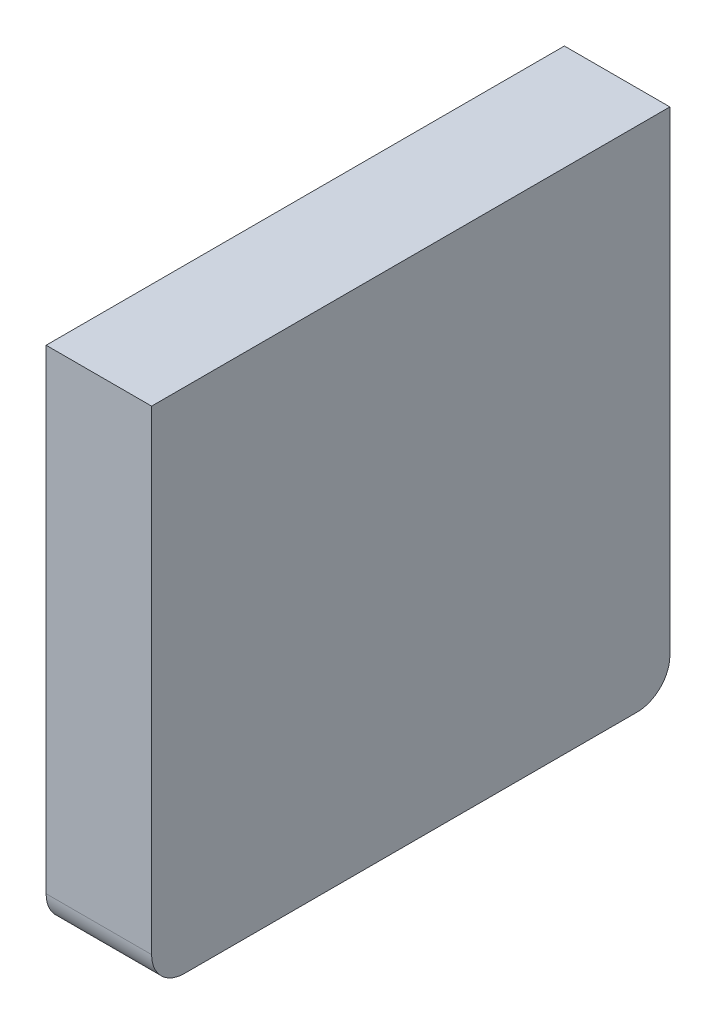
ISO-10303-21;
HEADER;
FILE_DESCRIPTION(('STEP AP214'),'2;1');
FILE_NAME('part.step','',(''),(''),'','','');
FILE_SCHEMA(('AUTOMOTIVE_DESIGN { 1 0 10303 214 1 1 1 1 }'));
ENDSEC;
DATA;
#1=APPLICATION_CONTEXT('core data for automotive mechanical design processes');
#2=APPLICATION_PROTOCOL_DEFINITION('international standard','automotive_design',2000,#1);
#3=PRODUCT_CONTEXT('',#1,'mechanical');
#4=PRODUCT('Part','Part','',(#3));
#5=PRODUCT_RELATED_PRODUCT_CATEGORY('part','',(#4));
#6=PRODUCT_DEFINITION_FORMATION('','',#4);
#7=PRODUCT_DEFINITION_CONTEXT('part definition',#1,'design');
#8=PRODUCT_DEFINITION('design','',#6,#7);
#9=PRODUCT_DEFINITION_SHAPE('','',#8);
#10=(LENGTH_UNIT() NAMED_UNIT(*) SI_UNIT(.MILLI.,.METRE.));
#11=(NAMED_UNIT(*) PLANE_ANGLE_UNIT() SI_UNIT($,.RADIAN.));
#12=(NAMED_UNIT(*) SI_UNIT($,.STERADIAN.) SOLID_ANGLE_UNIT());
#13=UNCERTAINTY_MEASURE_WITH_UNIT(LENGTH_MEASURE(1.E-05),#10,'distance_accuracy_value','');
#14=(GEOMETRIC_REPRESENTATION_CONTEXT(3) GLOBAL_UNCERTAINTY_ASSIGNED_CONTEXT((#13)) GLOBAL_UNIT_ASSIGNED_CONTEXT((#10,
#11,#12)) REPRESENTATION_CONTEXT('',''));
#15=CARTESIAN_POINT('',(0.,0.,0.));
#16=DIRECTION('',(0.,0.,1.));
#17=DIRECTION('',(1.,0.,0.));
#18=AXIS2_PLACEMENT_3D('',#15,#16,#17);
#19=CARTESIAN_POINT('',(0.,0.,803.656));
#20=DIRECTION('',(1.,0.,0.));
#21=DIRECTION('',(0.,0.,-1.));
#22=AXIS2_PLACEMENT_3D('',#19,#20,#21);
#23=PLANE('',#22);
#24=DIRECTION('',(0.,-1.,0.));
#25=VECTOR('',#24,1.);
#26=CARTESIAN_POINT('',(0.,0.,0.));
#27=LINE('',#26,#25);
#28=CARTESIAN_POINT('',(0.,787.4,0.));
#29=VERTEX_POINT('',#28);
#30=CARTESIAN_POINT('',(0.,50.8,0.));
#31=VERTEX_POINT('',#30);
#32=EDGE_CURVE('E115',#29,#31,#27,.T.);
#33=ORIENTED_EDGE('',*,*,#32,.T.);
#34=CARTESIAN_POINT('',(0.,50.8,50.8));
#35=DIRECTION('',(1.,0.,0.));
#36=DIRECTION('',(0.,0.,-1.));
#37=AXIS2_PLACEMENT_3D('',#34,#35,#36);
#38=CIRCLE('',#37,50.8);
#39=CARTESIAN_POINT('',(0.,0.,50.8));
#40=VERTEX_POINT('',#39);
#41=EDGE_CURVE('E41',#31,#40,#38,.F.);
#42=ORIENTED_EDGE('',*,*,#41,.T.);
#43=DIRECTION('',(0.,0.,-1.));
#44=VECTOR('',#43,1.);
#45=CARTESIAN_POINT('',(0.,0.,803.656));
#46=LINE('',#45,#44);
#47=CARTESIAN_POINT('',(0.,0.,752.856));
#48=VERTEX_POINT('',#47);
#49=EDGE_CURVE('E121',#48,#40,#46,.T.);
#50=ORIENTED_EDGE('',*,*,#49,.F.);
#51=CARTESIAN_POINT('',(0.,50.8,752.856));
#52=DIRECTION('',(1.,0.,0.));
#53=DIRECTION('',(0.,0.,-1.));
#54=AXIS2_PLACEMENT_3D('',#51,#52,#53);
#55=CIRCLE('',#54,50.8);
#56=CARTESIAN_POINT('',(0.,50.8,803.656));
#57=VERTEX_POINT('',#56);
#58=EDGE_CURVE('E48',#48,#57,#55,.F.);
#59=ORIENTED_EDGE('',*,*,#58,.T.);
#60=DIRECTION('',(0.,-1.,0.));
#61=VECTOR('',#60,1.);
#62=CARTESIAN_POINT('',(0.,0.,803.656));
#63=LINE('',#62,#61);
#64=CARTESIAN_POINT('',(0.,787.4,803.656));
#65=VERTEX_POINT('',#64);
#66=EDGE_CURVE('E97',#65,#57,#63,.T.);
#67=ORIENTED_EDGE('',*,*,#66,.F.);
#68=DIRECTION('',(0.,0.,-1.));
#69=VECTOR('',#68,1.);
#70=CARTESIAN_POINT('',(0.,787.4,803.656));
#71=LINE('',#70,#69);
#72=EDGE_CURVE('E107',#65,#29,#71,.T.);
#73=ORIENTED_EDGE('',*,*,#72,.T.);
#74=EDGE_LOOP('',(#33,#42,#50,#59,#67,#73));
#75=FACE_BOUND('',#74,.T.);
#76=ADVANCED_FACE('F33',(#75),#23,.F.);
#77=CARTESIAN_POINT('',(0.,0.,803.656));
#78=DIRECTION('',(0.,1.,0.));
#79=DIRECTION('',(0.,0.,1.));
#80=AXIS2_PLACEMENT_3D('',#77,#78,#79);
#81=PLANE('',#80);
#82=ORIENTED_EDGE('',*,*,#49,.T.);
#83=DIRECTION('',(1.,0.,0.));
#84=VECTOR('',#83,1.);
#85=CARTESIAN_POINT('',(163.576,0.,50.8));
#86=LINE('',#85,#84);
#87=CARTESIAN_POINT('',(163.576,0.,50.8));
#88=VERTEX_POINT('',#87);
#89=EDGE_CURVE('E126',#40,#88,#86,.T.);
#90=ORIENTED_EDGE('',*,*,#89,.T.);
#91=DIRECTION('',(0.,0.,-1.));
#92=VECTOR('',#91,1.);
#93=CARTESIAN_POINT('',(163.576,0.,803.656));
#94=LINE('',#93,#92);
#95=CARTESIAN_POINT('',(163.576,0.,752.856));
#96=VERTEX_POINT('',#95);
#97=EDGE_CURVE('E106',#96,#88,#94,.T.);
#98=ORIENTED_EDGE('',*,*,#97,.F.);
#99=DIRECTION('',(1.,0.,0.));
#100=VECTOR('',#99,1.);
#101=CARTESIAN_POINT('',(0.,0.,752.856));
#102=LINE('',#101,#100);
#103=EDGE_CURVE('E124',#96,#48,#102,.F.);
#104=ORIENTED_EDGE('',*,*,#103,.T.);
#105=EDGE_LOOP('',(#82,#90,#98,#104));
#106=FACE_BOUND('',#105,.T.);
#107=ADVANCED_FACE('F138',(#106),#81,.F.);
#108=CARTESIAN_POINT('',(163.576,0.,803.656));
#109=DIRECTION('',(-1.,0.,0.));
#110=DIRECTION('',(0.,-1.,0.));
#111=AXIS2_PLACEMENT_3D('',#108,#109,#110);
#112=PLANE('',#111);
#113=ORIENTED_EDGE('',*,*,#97,.T.);
#114=CARTESIAN_POINT('',(163.576,50.8,50.8));
#115=DIRECTION('',(-1.,0.,0.));
#116=DIRECTION('',(0.,-1.,0.));
#117=AXIS2_PLACEMENT_3D('',#114,#115,#116);
#118=CIRCLE('',#117,50.8);
#119=CARTESIAN_POINT('',(163.576,50.8,0.));
#120=VERTEX_POINT('',#119);
#121=EDGE_CURVE('E131',#88,#120,#118,.F.);
#122=ORIENTED_EDGE('',*,*,#121,.T.);
#123=DIRECTION('',(0.,1.,0.));
#124=VECTOR('',#123,1.);
#125=CARTESIAN_POINT('',(163.576,0.,0.));
#126=LINE('',#125,#124);
#127=CARTESIAN_POINT('',(163.576,787.4,0.));
#128=VERTEX_POINT('',#127);
#129=EDGE_CURVE('E103',#120,#128,#126,.T.);
#130=ORIENTED_EDGE('',*,*,#129,.T.);
#131=DIRECTION('',(0.,0.,-1.));
#132=VECTOR('',#131,1.);
#133=CARTESIAN_POINT('',(163.576,787.4,803.656));
#134=LINE('',#133,#132);
#135=CARTESIAN_POINT('',(163.576,787.4,803.656));
#136=VERTEX_POINT('',#135);
#137=EDGE_CURVE('E100',#136,#128,#134,.T.);
#138=ORIENTED_EDGE('',*,*,#137,.F.);
#139=DIRECTION('',(0.,1.,0.));
#140=VECTOR('',#139,1.);
#141=CARTESIAN_POINT('',(163.576,0.,803.656));
#142=LINE('',#141,#140);
#143=CARTESIAN_POINT('',(163.576,50.8,803.656));
#144=VERTEX_POINT('',#143);
#145=EDGE_CURVE('E89',#144,#136,#142,.T.);
#146=ORIENTED_EDGE('',*,*,#145,.F.);
#147=CARTESIAN_POINT('',(163.576,50.8,752.856));
#148=DIRECTION('',(-1.,0.,0.));
#149=DIRECTION('',(0.,-1.,0.));
#150=AXIS2_PLACEMENT_3D('',#147,#148,#149);
#151=CIRCLE('',#150,50.8);
#152=EDGE_CURVE('E129',#144,#96,#151,.F.);
#153=ORIENTED_EDGE('',*,*,#152,.T.);
#154=EDGE_LOOP('',(#113,#122,#130,#138,#146,#153));
#155=FACE_BOUND('',#154,.T.);
#156=ADVANCED_FACE('F102',(#155),#112,.F.);
#157=CARTESIAN_POINT('',(0.,787.4,803.656));
#158=DIRECTION('',(0.,-1.,0.));
#159=DIRECTION('',(0.,0.,-1.));
#160=AXIS2_PLACEMENT_3D('',#157,#158,#159);
#161=PLANE('',#160);
#162=DIRECTION('',(-1.,0.,0.));
#163=VECTOR('',#162,1.);
#164=CARTESIAN_POINT('',(0.,787.4,0.));
#165=LINE('',#164,#163);
#166=EDGE_CURVE('E118',#128,#29,#165,.T.);
#167=ORIENTED_EDGE('',*,*,#166,.T.);
#168=ORIENTED_EDGE('',*,*,#72,.F.);
#169=DIRECTION('',(-1.,0.,0.));
#170=VECTOR('',#169,1.);
#171=CARTESIAN_POINT('',(0.,787.4,803.656));
#172=LINE('',#171,#170);
#173=EDGE_CURVE('E93',#136,#65,#172,.T.);
#174=ORIENTED_EDGE('',*,*,#173,.F.);
#175=ORIENTED_EDGE('',*,*,#137,.T.);
#176=EDGE_LOOP('',(#167,#168,#174,#175));
#177=FACE_BOUND('',#176,.T.);
#178=ADVANCED_FACE('F109',(#177),#161,.F.);
#179=CARTESIAN_POINT('',(0.,0.,803.656));
#180=DIRECTION('',(0.,0.,-1.));
#181=DIRECTION('',(-1.,0.,0.));
#182=AXIS2_PLACEMENT_3D('',#179,#180,#181);
#183=PLANE('',#182);
#184=ORIENTED_EDGE('',*,*,#66,.T.);
#185=DIRECTION('',(1.,0.,0.));
#186=VECTOR('',#185,1.);
#187=CARTESIAN_POINT('',(0.,50.8,803.656));
#188=LINE('',#187,#186);
#189=EDGE_CURVE('E11',#57,#144,#188,.T.);
#190=ORIENTED_EDGE('',*,*,#189,.T.);
#191=ORIENTED_EDGE('',*,*,#145,.T.);
#192=ORIENTED_EDGE('',*,*,#173,.T.);
#193=EDGE_LOOP('',(#184,#190,#191,#192));
#194=FACE_BOUND('',#193,.T.);
#195=ADVANCED_FACE('F91',(#194),#183,.F.);
#196=CARTESIAN_POINT('',(0.,0.,0.));
#197=DIRECTION('',(0.,0.,-1.));
#198=DIRECTION('',(-1.,0.,0.));
#199=AXIS2_PLACEMENT_3D('',#196,#197,#198);
#200=PLANE('',#199);
#201=ORIENTED_EDGE('',*,*,#129,.F.);
#202=DIRECTION('',(1.,0.,0.));
#203=VECTOR('',#202,1.);
#204=CARTESIAN_POINT('',(0.,50.8,0.));
#205=LINE('',#204,#203);
#206=EDGE_CURVE('E56',#120,#31,#205,.F.);
#207=ORIENTED_EDGE('',*,*,#206,.T.);
#208=ORIENTED_EDGE('',*,*,#32,.F.);
#209=ORIENTED_EDGE('',*,*,#166,.F.);
#210=EDGE_LOOP('',(#201,#207,#208,#209));
#211=FACE_BOUND('',#210,.T.);
#212=ADVANCED_FACE('F142',(#211),#200,.T.);
#213=CARTESIAN_POINT('',(0.,50.8,50.8));
#214=DIRECTION('',(-1.,0.,0.));
#215=DIRECTION('',(0.,0.,1.));
#216=AXIS2_PLACEMENT_3D('',#213,#214,#215);
#217=CYLINDRICAL_SURFACE('',#216,50.8);
#218=ORIENTED_EDGE('',*,*,#41,.F.);
#219=ORIENTED_EDGE('',*,*,#206,.F.);
#220=ORIENTED_EDGE('',*,*,#121,.F.);
#221=ORIENTED_EDGE('',*,*,#89,.F.);
#222=EDGE_LOOP('',(#218,#219,#220,#221));
#223=FACE_BOUND('',#222,.T.);
#224=ADVANCED_FACE('F141',(#223),#217,.T.);
#225=CARTESIAN_POINT('',(0.,50.8,752.856));
#226=DIRECTION('',(1.,0.,0.));
#227=DIRECTION('',(0.,0.,-1.));
#228=AXIS2_PLACEMENT_3D('',#225,#226,#227);
#229=CYLINDRICAL_SURFACE('',#228,50.8);
#230=ORIENTED_EDGE('',*,*,#58,.F.);
#231=ORIENTED_EDGE('',*,*,#103,.F.);
#232=ORIENTED_EDGE('',*,*,#152,.F.);
#233=ORIENTED_EDGE('',*,*,#189,.F.);
#234=EDGE_LOOP('',(#230,#231,#232,#233));
#235=FACE_BOUND('',#234,.T.);
#236=ADVANCED_FACE('F35',(#235),#229,.T.);
#237=CLOSED_SHELL('',(#76,#107,#156,#178,#195,#212,#224,#236));
#238=MANIFOLD_SOLID_BREP('B2',#237);
#239=ADVANCED_BREP_SHAPE_REPRESENTATION('',(#18,#238),#14);
#240=SHAPE_DEFINITION_REPRESENTATION(#9,#239);
ENDSEC;
END-ISO-10303-21;
